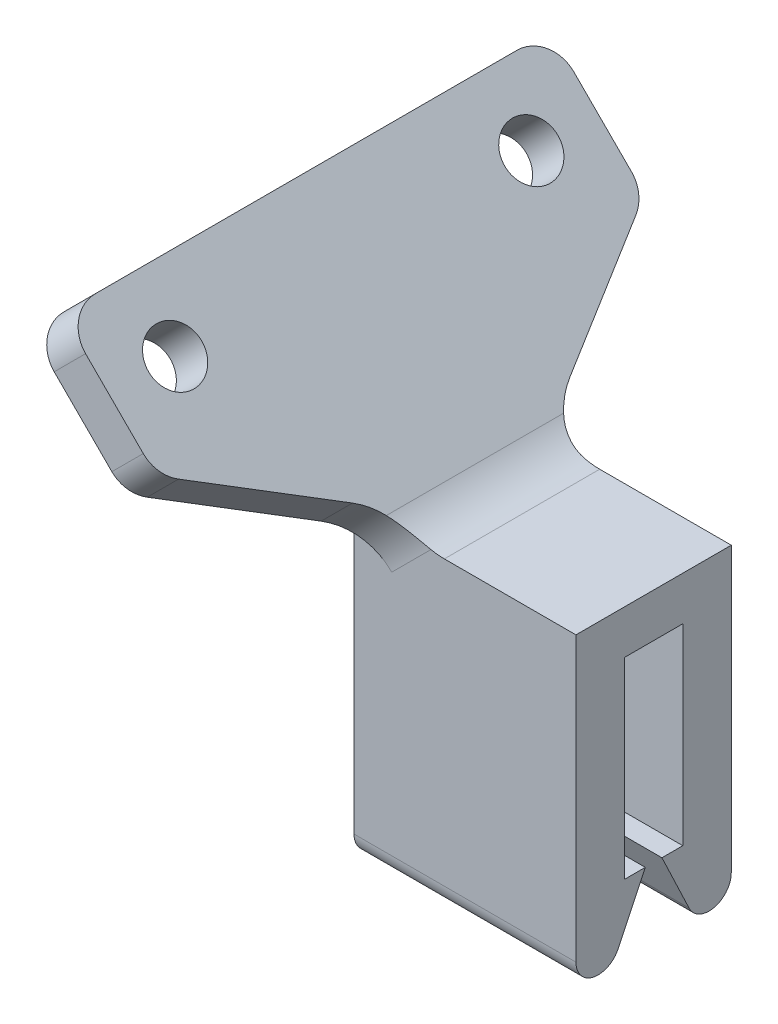
ISO-10303-21;
HEADER;
FILE_DESCRIPTION(('STEP AP214'),'2;1');
FILE_NAME('part.step','',(''),(''),'','','');
FILE_SCHEMA(('AUTOMOTIVE_DESIGN { 1 0 10303 214 1 1 1 1 }'));
ENDSEC;
DATA;
#1=APPLICATION_CONTEXT('core data for automotive mechanical design processes');
#2=APPLICATION_PROTOCOL_DEFINITION('international standard','automotive_design',2000,#1);
#3=PRODUCT_CONTEXT('',#1,'mechanical');
#4=PRODUCT('Part','Part','',(#3));
#5=PRODUCT_RELATED_PRODUCT_CATEGORY('part','',(#4));
#6=PRODUCT_DEFINITION_FORMATION('','',#4);
#7=PRODUCT_DEFINITION_CONTEXT('part definition',#1,'design');
#8=PRODUCT_DEFINITION('design','',#6,#7);
#9=PRODUCT_DEFINITION_SHAPE('','',#8);
#10=(LENGTH_UNIT() NAMED_UNIT(*) SI_UNIT(.MILLI.,.METRE.));
#11=(NAMED_UNIT(*) PLANE_ANGLE_UNIT() SI_UNIT($,.RADIAN.));
#12=(NAMED_UNIT(*) SI_UNIT($,.STERADIAN.) SOLID_ANGLE_UNIT());
#13=UNCERTAINTY_MEASURE_WITH_UNIT(LENGTH_MEASURE(1.E-05),#10,'distance_accuracy_value','');
#14=(GEOMETRIC_REPRESENTATION_CONTEXT(3) GLOBAL_UNCERTAINTY_ASSIGNED_CONTEXT((#13)) GLOBAL_UNIT_ASSIGNED_CONTEXT((#10,
#11,#12)) REPRESENTATION_CONTEXT('',''));
#15=CARTESIAN_POINT('',(0.,0.,0.));
#16=DIRECTION('',(0.,0.,1.));
#17=DIRECTION('',(1.,0.,0.));
#18=AXIS2_PLACEMENT_3D('',#15,#16,#17);
#19=CARTESIAN_POINT('',(10.,4.33,1.315));
#20=DIRECTION('',(0.,1.,0.));
#21=DIRECTION('',(0.,0.,1.));
#22=AXIS2_PLACEMENT_3D('',#19,#20,#21);
#23=PLANE('',#22);
#24=DIRECTION('',(0.,0.,-1.));
#25=VECTOR('',#24,1.);
#26=CARTESIAN_POINT('',(0.,4.33,1.315));
#27=LINE('',#26,#25);
#28=CARTESIAN_POINT('',(0.,4.33,1.315));
#29=VERTEX_POINT('',#28);
#30=CARTESIAN_POINT('',(0.,4.33,-1.315));
#31=VERTEX_POINT('',#30);
#32=EDGE_CURVE('E295',#29,#31,#27,.T.);
#33=ORIENTED_EDGE('',*,*,#32,.T.);
#34=DIRECTION('',(-1.,0.,0.));
#35=VECTOR('',#34,1.);
#36=CARTESIAN_POINT('',(10.,4.33,-1.315));
#37=LINE('',#36,#35);
#38=CARTESIAN_POINT('',(10.,4.33,-1.315));
#39=VERTEX_POINT('',#38);
#40=EDGE_CURVE('E383',#39,#31,#37,.T.);
#41=ORIENTED_EDGE('',*,*,#40,.F.);
#42=DIRECTION('',(0.,0.,-1.));
#43=VECTOR('',#42,1.);
#44=CARTESIAN_POINT('',(10.,4.33,1.315));
#45=LINE('',#44,#43);
#46=CARTESIAN_POINT('',(10.,4.33,1.315));
#47=VERTEX_POINT('',#46);
#48=EDGE_CURVE('E296',#47,#39,#45,.T.);
#49=ORIENTED_EDGE('',*,*,#48,.F.);
#50=DIRECTION('',(-1.,0.,0.));
#51=VECTOR('',#50,1.);
#52=CARTESIAN_POINT('',(10.,4.33,1.315));
#53=LINE('',#52,#51);
#54=EDGE_CURVE('E326',#47,#29,#53,.T.);
#55=ORIENTED_EDGE('',*,*,#54,.T.);
#56=EDGE_LOOP('',(#33,#41,#49,#55));
#57=FACE_BOUND('',#56,.T.);
#58=ADVANCED_FACE('F43',(#57),#23,.F.);
#59=CARTESIAN_POINT('',(10.,4.33,-1.315));
#60=DIRECTION('',(0.,0.,-1.));
#61=DIRECTION('',(0.,1.,0.));
#62=AXIS2_PLACEMENT_3D('',#59,#60,#61);
#63=PLANE('',#62);
#64=DIRECTION('',(0.,-1.,0.));
#65=VECTOR('',#64,1.);
#66=CARTESIAN_POINT('',(0.,4.33,-1.315));
#67=LINE('',#66,#65);
#68=CARTESIAN_POINT('',(0.,-4.33,-1.315));
#69=VERTEX_POINT('',#68);
#70=EDGE_CURVE('E329',#31,#69,#67,.T.);
#71=ORIENTED_EDGE('',*,*,#70,.T.);
#72=DIRECTION('',(-1.,0.,0.));
#73=VECTOR('',#72,1.);
#74=CARTESIAN_POINT('',(10.,-4.33,-1.315));
#75=LINE('',#74,#73);
#76=CARTESIAN_POINT('',(10.,-4.33,-1.315));
#77=VERTEX_POINT('',#76);
#78=EDGE_CURVE('E381',#77,#69,#75,.T.);
#79=ORIENTED_EDGE('',*,*,#78,.F.);
#80=DIRECTION('',(0.,-1.,0.));
#81=VECTOR('',#80,1.);
#82=CARTESIAN_POINT('',(10.,4.33,-1.315));
#83=LINE('',#82,#81);
#84=EDGE_CURVE('E299',#39,#77,#83,.T.);
#85=ORIENTED_EDGE('',*,*,#84,.F.);
#86=ORIENTED_EDGE('',*,*,#40,.T.);
#87=EDGE_LOOP('',(#71,#79,#85,#86));
#88=FACE_BOUND('',#87,.T.);
#89=ADVANCED_FACE('F442',(#88),#63,.F.);
#90=CARTESIAN_POINT('',(10.,-4.33,-0.375));
#91=DIRECTION('',(0.,1.,0.));
#92=DIRECTION('',(0.,0.,1.));
#93=AXIS2_PLACEMENT_3D('',#90,#91,#92);
#94=PLANE('',#93);
#95=DIRECTION('',(0.,0.,-1.));
#96=VECTOR('',#95,1.);
#97=CARTESIAN_POINT('',(0.,-4.33,-0.375));
#98=LINE('',#97,#96);
#99=CARTESIAN_POINT('',(0.,-4.33,-0.375));
#100=VERTEX_POINT('',#99);
#101=EDGE_CURVE('E332',#100,#69,#98,.T.);
#102=ORIENTED_EDGE('',*,*,#101,.F.);
#103=DIRECTION('',(-1.,0.,0.));
#104=VECTOR('',#103,1.);
#105=CARTESIAN_POINT('',(10.,-4.33,-0.375));
#106=LINE('',#105,#104);
#107=CARTESIAN_POINT('',(10.,-4.33,-0.375));
#108=VERTEX_POINT('',#107);
#109=EDGE_CURVE('E378',#108,#100,#106,.T.);
#110=ORIENTED_EDGE('',*,*,#109,.F.);
#111=DIRECTION('',(0.,0.,-1.));
#112=VECTOR('',#111,1.);
#113=CARTESIAN_POINT('',(10.,-4.33,-0.375));
#114=LINE('',#113,#112);
#115=EDGE_CURVE('E302',#108,#77,#114,.T.);
#116=ORIENTED_EDGE('',*,*,#115,.T.);
#117=ORIENTED_EDGE('',*,*,#78,.T.);
#118=EDGE_LOOP('',(#102,#110,#116,#117));
#119=FACE_BOUND('',#118,.T.);
#120=ADVANCED_FACE('F448',(#119),#94,.T.);
#121=CARTESIAN_POINT('',(10.,-6.31074986405307,-1.315));
#122=DIRECTION('',(0.,0.42873816679033,-0.903428793174795));
#123=DIRECTION('',(0.,0.903428793174795,0.42873816679033));
#124=AXIS2_PLACEMENT_3D('',#121,#122,#123);
#125=PLANE('',#124);
#126=DIRECTION('',(0.,-0.903428793174795,-0.42873816679033));
#127=VECTOR('',#126,1.);
#128=CARTESIAN_POINT('',(0.,-6.31074986405307,-1.315));
#129=LINE('',#128,#127);
#130=CARTESIAN_POINT('',(0.,-6.904071278564,-1.5965712068252));
#131=VERTEX_POINT('',#130);
#132=EDGE_CURVE('E335',#100,#131,#129,.T.);
#133=ORIENTED_EDGE('',*,*,#132,.T.);
#134=DIRECTION('',(-1.,0.,0.));
#135=VECTOR('',#134,1.);
#136=CARTESIAN_POINT('',(10.,-6.904071278564,-1.5965712068252));
#137=LINE('',#136,#135);
#138=CARTESIAN_POINT('',(10.,-6.904071278564,-1.5965712068252));
#139=VERTEX_POINT('',#138);
#140=EDGE_CURVE('E375',#139,#131,#137,.T.);
#141=ORIENTED_EDGE('',*,*,#140,.F.);
#142=DIRECTION('',(0.,0.903428793174795,0.428738166790331));
#143=VECTOR('',#142,1.);
#144=CARTESIAN_POINT('',(10.,-6.31074986405307,-1.315));
#145=LINE('',#144,#143);
#146=EDGE_CURVE('E305',#139,#108,#145,.T.);
#147=ORIENTED_EDGE('',*,*,#146,.T.);
#148=ORIENTED_EDGE('',*,*,#109,.T.);
#149=EDGE_LOOP('',(#133,#141,#147,#148));
#150=FACE_BOUND('',#149,.T.);
#151=ADVANCED_FACE('F602',(#150),#125,.F.);
#152=CARTESIAN_POINT('',(10.,-6.47533311177367,-2.5));
#153=DIRECTION('',(-1.,0.,0.));
#154=DIRECTION('',(0.,0.,1.));
#155=AXIS2_PLACEMENT_3D('',#152,#153,#154);
#156=CYLINDRICAL_SURFACE('',#155,1.);
#157=CARTESIAN_POINT('',(0.,-6.47533311177367,-2.5));
#158=DIRECTION('',(1.,0.,0.));
#159=DIRECTION('',(0.,0.,-1.));
#160=AXIS2_PLACEMENT_3D('',#157,#158,#159);
#161=CIRCLE('',#160,1.);
#162=CARTESIAN_POINT('',(0.,-6.47533311177367,-3.5));
#163=VERTEX_POINT('',#162);
#164=EDGE_CURVE('E337',#131,#163,#161,.T.);
#165=ORIENTED_EDGE('',*,*,#164,.T.);
#166=DIRECTION('',(-1.,0.,0.));
#167=VECTOR('',#166,1.);
#168=CARTESIAN_POINT('',(10.,-6.47533311177367,-3.5));
#169=LINE('',#168,#167);
#170=CARTESIAN_POINT('',(10.,-6.47533311177367,-3.5));
#171=VERTEX_POINT('',#170);
#172=EDGE_CURVE('E372',#171,#163,#169,.T.);
#173=ORIENTED_EDGE('',*,*,#172,.F.);
#174=CARTESIAN_POINT('',(10.,-6.47533311177367,-2.5));
#175=DIRECTION('',(1.,0.,0.));
#176=DIRECTION('',(0.,0.,-1.));
#177=AXIS2_PLACEMENT_3D('',#174,#175,#176);
#178=CIRCLE('',#177,1.);
#179=EDGE_CURVE('E308',#139,#171,#178,.T.);
#180=ORIENTED_EDGE('',*,*,#179,.F.);
#181=ORIENTED_EDGE('',*,*,#140,.T.);
#182=EDGE_LOOP('',(#165,#173,#180,#181));
#183=FACE_BOUND('',#182,.T.);
#184=ADVANCED_FACE('F599',(#183),#156,.T.);
#185=CARTESIAN_POINT('',(10.,-6.4753331117736,-3.5));
#186=DIRECTION('',(0.,0.,1.));
#187=DIRECTION('',(1.,0.,0.));
#188=AXIS2_PLACEMENT_3D('',#185,#186,#187);
#189=PLANE('',#188);
#190=DIRECTION('',(-0.707106781186548,0.707106781186548,0.));
#191=VECTOR('',#190,1.);
#192=CARTESIAN_POINT('',(11.3901665558868,-5.0851665558868,-3.5));
#193=LINE('',#192,#191);
#194=CARTESIAN_POINT('',(1.70203974095488,4.60296025904512,-3.5));
#195=VERTEX_POINT('',#194);
#196=CARTESIAN_POINT('',(-0.878679656440356,7.18367965644036,-3.5));
#197=VERTEX_POINT('',#196);
#198=EDGE_CURVE('E288',#195,#197,#193,.T.);
#199=ORIENTED_EDGE('',*,*,#198,.F.);
#200=DIRECTION('',(0.707106781186548,0.707106781186547,0.));
#201=VECTOR('',#200,1.);
#202=CARTESIAN_POINT('',(0.311873185068085,3.21279370315832,-3.5));
#203=LINE('',#202,#201);
#204=CARTESIAN_POINT('',(3.46577678018442,6.36669729827466,-3.5));
#205=VERTEX_POINT('',#204);
#206=EDGE_CURVE('E404',#195,#205,#203,.T.);
#207=ORIENTED_EDGE('',*,*,#206,.T.);
#208=CARTESIAN_POINT('',(4.07106781186547,9.30500000000001,-3.5));
#209=DIRECTION('',(0.,0.,1.));
#210=DIRECTION('',(1.,0.,0.));
#211=AXIS2_PLACEMENT_3D('',#208,#209,#210);
#212=CIRCLE('',#211,3.);
#213=CARTESIAN_POINT('',(4.07106781186547,6.30500000000001,-3.5));
#214=VERTEX_POINT('',#213);
#215=EDGE_CURVE('E399',#205,#214,#212,.T.);
#216=ORIENTED_EDGE('',*,*,#215,.T.);
#217=DIRECTION('',(-1.,0.,0.));
#218=VECTOR('',#217,1.);
#219=CARTESIAN_POINT('',(10.,6.30500000000001,-3.5));
#220=LINE('',#219,#218);
#221=CARTESIAN_POINT('',(10.,6.30500000000001,-3.5));
#222=VERTEX_POINT('',#221);
#223=EDGE_CURVE('E369',#222,#214,#220,.T.);
#224=ORIENTED_EDGE('',*,*,#223,.F.);
#225=DIRECTION('',(0.,1.,0.));
#226=VECTOR('',#225,1.);
#227=CARTESIAN_POINT('',(10.,-6.4753331117736,-3.5));
#228=LINE('',#227,#226);
#229=EDGE_CURVE('E310',#171,#222,#228,.T.);
#230=ORIENTED_EDGE('',*,*,#229,.F.);
#231=ORIENTED_EDGE('',*,*,#172,.T.);
#232=DIRECTION('',(0.,1.,0.));
#233=VECTOR('',#232,1.);
#234=CARTESIAN_POINT('',(0.,-6.4753331117736,-3.5));
#235=LINE('',#234,#233);
#236=CARTESIAN_POINT('',(0.,5.06235931288071,-3.5));
#237=VERTEX_POINT('',#236);
#238=EDGE_CURVE('E339',#163,#237,#235,.T.);
#239=ORIENTED_EDGE('',*,*,#238,.T.);
#240=CARTESIAN_POINT('',(-3.,5.06235931288072,-3.5));
#241=DIRECTION('',(0.,0.,1.));
#242=DIRECTION('',(1.,0.,0.));
#243=AXIS2_PLACEMENT_3D('',#240,#241,#242);
#244=CIRCLE('',#243,3.);
#245=EDGE_CURVE('E392',#237,#197,#244,.T.);
#246=ORIENTED_EDGE('',*,*,#245,.T.);
#247=EDGE_LOOP('',(#199,#207,#216,#224,#230,#231,#239,#246));
#248=FACE_BOUND('',#247,.T.);
#249=ADVANCED_FACE('F514',(#248),#189,.F.);
#250=CARTESIAN_POINT('',(10.,6.30500000000001,3.5));
#251=DIRECTION('',(0.,1.,0.));
#252=DIRECTION('',(0.,0.,1.));
#253=AXIS2_PLACEMENT_3D('',#250,#251,#252);
#254=PLANE('',#253);
#255=ORIENTED_EDGE('',*,*,#223,.T.);
#256=DIRECTION('',(0.,0.,-1.));
#257=VECTOR('',#256,1.);
#258=CARTESIAN_POINT('',(4.07106781186548,6.30500000000001,3.5));
#259=LINE('',#258,#257);
#260=CARTESIAN_POINT('',(4.07106781186548,6.30500000000001,3.5));
#261=VERTEX_POINT('',#260);
#262=EDGE_CURVE('E397',#214,#261,#259,.F.);
#263=ORIENTED_EDGE('',*,*,#262,.T.);
#264=DIRECTION('',(-1.,0.,0.));
#265=VECTOR('',#264,1.);
#266=CARTESIAN_POINT('',(10.,6.30500000000001,3.5));
#267=LINE('',#266,#265);
#268=CARTESIAN_POINT('',(10.,6.30500000000001,3.5));
#269=VERTEX_POINT('',#268);
#270=EDGE_CURVE('E366',#269,#261,#267,.T.);
#271=ORIENTED_EDGE('',*,*,#270,.F.);
#272=DIRECTION('',(0.,0.,-1.));
#273=VECTOR('',#272,1.);
#274=CARTESIAN_POINT('',(10.,6.30500000000001,3.5));
#275=LINE('',#274,#273);
#276=EDGE_CURVE('E312',#269,#222,#275,.T.);
#277=ORIENTED_EDGE('',*,*,#276,.T.);
#278=EDGE_LOOP('',(#255,#263,#271,#277));
#279=FACE_BOUND('',#278,.T.);
#280=ADVANCED_FACE('F594',(#279),#254,.T.);
#281=CARTESIAN_POINT('',(10.,6.30500000000001,3.5));
#282=DIRECTION('',(0.,0.,-1.));
#283=DIRECTION('',(0.,1.,0.));
#284=AXIS2_PLACEMENT_3D('',#281,#282,#283);
#285=PLANE('',#284);
#286=CARTESIAN_POINT('',(4.07106781186548,9.30500000000001,3.5));
#287=DIRECTION('',(0.,0.,-1.));
#288=DIRECTION('',(0.,1.,0.));
#289=AXIS2_PLACEMENT_3D('',#286,#287,#288);
#290=CIRCLE('',#289,3.);
#291=CARTESIAN_POINT('',(3.46577678018443,6.36669729827466,3.5));
#292=VERTEX_POINT('',#291);
#293=EDGE_CURVE('E401',#261,#292,#290,.T.);
#294=ORIENTED_EDGE('',*,*,#293,.T.);
#295=DIRECTION('',(0.707106781186548,0.707106781186547,0.));
#296=VECTOR('',#295,1.);
#297=CARTESIAN_POINT('',(6.70203974095489,9.60296025904512,3.5));
#298=LINE('',#297,#296);
#299=CARTESIAN_POINT('',(1.70203974095489,4.60296025904512,3.5));
#300=VERTEX_POINT('',#299);
#301=EDGE_CURVE('E412',#292,#300,#298,.F.);
#302=ORIENTED_EDGE('',*,*,#301,.T.);
#303=DIRECTION('',(0.707106781186548,-0.707106781186548,0.));
#304=VECTOR('',#303,1.);
#305=CARTESIAN_POINT('',(5.,1.30500000000001,3.5));
#306=LINE('',#305,#304);
#307=CARTESIAN_POINT('',(-0.878679656440356,7.18367965644036,3.5));
#308=VERTEX_POINT('',#307);
#309=EDGE_CURVE('E286',#308,#300,#306,.T.);
#310=ORIENTED_EDGE('',*,*,#309,.F.);
#311=CARTESIAN_POINT('',(-3.,5.06235931288072,3.5));
#312=DIRECTION('',(0.,0.,-1.));
#313=DIRECTION('',(0.,1.,0.));
#314=AXIS2_PLACEMENT_3D('',#311,#312,#313);
#315=CIRCLE('',#314,3.);
#316=CARTESIAN_POINT('',(0.,5.06235931288072,3.5));
#317=VERTEX_POINT('',#316);
#318=EDGE_CURVE('E394',#308,#317,#315,.T.);
#319=ORIENTED_EDGE('',*,*,#318,.T.);
#320=DIRECTION('',(0.,-1.,0.));
#321=VECTOR('',#320,1.);
#322=CARTESIAN_POINT('',(0.,6.30500000000001,3.5));
#323=LINE('',#322,#321);
#324=CARTESIAN_POINT('',(0.,-6.46785943351065,3.5));
#325=VERTEX_POINT('',#324);
#326=EDGE_CURVE('E342',#317,#325,#323,.T.);
#327=ORIENTED_EDGE('',*,*,#326,.T.);
#328=DIRECTION('',(-1.,0.,0.));
#329=VECTOR('',#328,1.);
#330=CARTESIAN_POINT('',(10.,-6.46785943351065,3.5));
#331=LINE('',#330,#329);
#332=CARTESIAN_POINT('',(10.,-6.46785943351065,3.5));
#333=VERTEX_POINT('',#332);
#334=EDGE_CURVE('E363',#333,#325,#331,.T.);
#335=ORIENTED_EDGE('',*,*,#334,.F.);
#336=DIRECTION('',(0.,-1.,0.));
#337=VECTOR('',#336,1.);
#338=CARTESIAN_POINT('',(10.,6.30500000000001,3.5));
#339=LINE('',#338,#337);
#340=EDGE_CURVE('E315',#269,#333,#339,.T.);
#341=ORIENTED_EDGE('',*,*,#340,.F.);
#342=ORIENTED_EDGE('',*,*,#270,.T.);
#343=EDGE_LOOP('',(#294,#302,#310,#319,#327,#335,#341,#342));
#344=FACE_BOUND('',#343,.T.);
#345=ADVANCED_FACE('F469',(#344),#285,.F.);
#346=CARTESIAN_POINT('',(10.,-6.46785943351065,2.5));
#347=DIRECTION('',(-1.,0.,0.));
#348=DIRECTION('',(0.,0.,1.));
#349=AXIS2_PLACEMENT_3D('',#346,#347,#348);
#350=CYLINDRICAL_SURFACE('',#349,1.);
#351=CARTESIAN_POINT('',(0.,-6.46785943351065,2.5));
#352=DIRECTION('',(1.,0.,0.));
#353=DIRECTION('',(0.,0.,-1.));
#354=AXIS2_PLACEMENT_3D('',#351,#352,#353);
#355=CIRCLE('',#354,1.);
#356=CARTESIAN_POINT('',(0.,-6.89761553915994,1.59705499079005));
#357=VERTEX_POINT('',#356);
#358=EDGE_CURVE('E344',#325,#357,#355,.T.);
#359=ORIENTED_EDGE('',*,*,#358,.T.);
#360=DIRECTION('',(-1.,0.,0.));
#361=VECTOR('',#360,1.);
#362=CARTESIAN_POINT('',(10.,-6.89761553915994,1.59705499079005));
#363=LINE('',#362,#361);
#364=CARTESIAN_POINT('',(10.,-6.89761553915994,1.59705499079005));
#365=VERTEX_POINT('',#364);
#366=EDGE_CURVE('E360',#365,#357,#363,.T.);
#367=ORIENTED_EDGE('',*,*,#366,.F.);
#368=CARTESIAN_POINT('',(10.,-6.46785943351065,2.5));
#369=DIRECTION('',(1.,0.,0.));
#370=DIRECTION('',(0.,0.,-1.));
#371=AXIS2_PLACEMENT_3D('',#368,#369,#370);
#372=CIRCLE('',#371,1.);
#373=EDGE_CURVE('E317',#333,#365,#372,.T.);
#374=ORIENTED_EDGE('',*,*,#373,.F.);
#375=ORIENTED_EDGE('',*,*,#334,.T.);
#376=EDGE_LOOP('',(#359,#367,#374,#375));
#377=FACE_BOUND('',#376,.T.);
#378=ADVANCED_FACE('F478',(#377),#350,.T.);
#379=CARTESIAN_POINT('',(10.,-6.305,1.315));
#380=DIRECTION('',(0.,0.429756105649292,0.902945009209949));
#381=DIRECTION('',(0.,-0.902945009209949,0.429756105649292));
#382=AXIS2_PLACEMENT_3D('',#379,#380,#381);
#383=PLANE('',#382);
#384=DIRECTION('',(0.,0.902945009209949,-0.429756105649292));
#385=VECTOR('',#384,1.);
#386=CARTESIAN_POINT('',(0.,-6.305,1.315));
#387=LINE('',#386,#385);
#388=CARTESIAN_POINT('',(0.,-4.33,0.375));
#389=VERTEX_POINT('',#388);
#390=EDGE_CURVE('E347',#357,#389,#387,.T.);
#391=ORIENTED_EDGE('',*,*,#390,.T.);
#392=DIRECTION('',(-1.,0.,0.));
#393=VECTOR('',#392,1.);
#394=CARTESIAN_POINT('',(10.,-4.33,0.375));
#395=LINE('',#394,#393);
#396=CARTESIAN_POINT('',(10.,-4.33,0.375));
#397=VERTEX_POINT('',#396);
#398=EDGE_CURVE('E357',#397,#389,#395,.T.);
#399=ORIENTED_EDGE('',*,*,#398,.F.);
#400=DIRECTION('',(0.,0.902945009209948,-0.429756105649294));
#401=VECTOR('',#400,1.);
#402=CARTESIAN_POINT('',(10.,-6.89761553915994,1.59705499079005));
#403=LINE('',#402,#401);
#404=EDGE_CURVE('E319',#365,#397,#403,.T.);
#405=ORIENTED_EDGE('',*,*,#404,.F.);
#406=ORIENTED_EDGE('',*,*,#366,.T.);
#407=EDGE_LOOP('',(#391,#399,#405,#406));
#408=FACE_BOUND('',#407,.T.);
#409=ADVANCED_FACE('F482',(#408),#383,.F.);
#410=CARTESIAN_POINT('',(10.,-4.33,0.375));
#411=DIRECTION('',(0.,-1.,0.));
#412=DIRECTION('',(0.,0.,-1.));
#413=AXIS2_PLACEMENT_3D('',#410,#411,#412);
#414=PLANE('',#413);
#415=DIRECTION('',(0.,0.,1.));
#416=VECTOR('',#415,1.);
#417=CARTESIAN_POINT('',(0.,-4.33,0.375));
#418=LINE('',#417,#416);
#419=CARTESIAN_POINT('',(0.,-4.33,1.315));
#420=VERTEX_POINT('',#419);
#421=EDGE_CURVE('E349',#389,#420,#418,.T.);
#422=ORIENTED_EDGE('',*,*,#421,.T.);
#423=DIRECTION('',(-1.,0.,0.));
#424=VECTOR('',#423,1.);
#425=CARTESIAN_POINT('',(10.,-4.33,1.315));
#426=LINE('',#425,#424);
#427=CARTESIAN_POINT('',(10.,-4.33,1.315));
#428=VERTEX_POINT('',#427);
#429=EDGE_CURVE('E355',#428,#420,#426,.T.);
#430=ORIENTED_EDGE('',*,*,#429,.F.);
#431=DIRECTION('',(0.,0.,1.));
#432=VECTOR('',#431,1.);
#433=CARTESIAN_POINT('',(10.,-4.33,0.375));
#434=LINE('',#433,#432);
#435=EDGE_CURVE('E321',#397,#428,#434,.T.);
#436=ORIENTED_EDGE('',*,*,#435,.F.);
#437=ORIENTED_EDGE('',*,*,#398,.T.);
#438=EDGE_LOOP('',(#422,#430,#436,#437));
#439=FACE_BOUND('',#438,.T.);
#440=ADVANCED_FACE('F583',(#439),#414,.F.);
#441=CARTESIAN_POINT('',(10.,4.33,1.315));
#442=DIRECTION('',(0.,0.,-1.));
#443=DIRECTION('',(0.,1.,0.));
#444=AXIS2_PLACEMENT_3D('',#441,#442,#443);
#445=PLANE('',#444);
#446=DIRECTION('',(0.,-1.,0.));
#447=VECTOR('',#446,1.);
#448=CARTESIAN_POINT('',(0.,4.33,1.315));
#449=LINE('',#448,#447);
#450=EDGE_CURVE('E300',#29,#420,#449,.T.);
#451=ORIENTED_EDGE('',*,*,#450,.F.);
#452=ORIENTED_EDGE('',*,*,#54,.F.);
#453=DIRECTION('',(0.,-1.,0.));
#454=VECTOR('',#453,1.);
#455=CARTESIAN_POINT('',(10.,4.33,1.315));
#456=LINE('',#455,#454);
#457=EDGE_CURVE('E323',#47,#428,#456,.T.);
#458=ORIENTED_EDGE('',*,*,#457,.T.);
#459=ORIENTED_EDGE('',*,*,#429,.T.);
#460=EDGE_LOOP('',(#451,#452,#458,#459));
#461=FACE_BOUND('',#460,.T.);
#462=ADVANCED_FACE('F578',(#461),#445,.T.);
#463=CARTESIAN_POINT('',(10.,-6.47533311177367,-2.5));
#464=DIRECTION('',(1.,0.,0.));
#465=DIRECTION('',(0.,0.,-1.));
#466=AXIS2_PLACEMENT_3D('',#463,#464,#465);
#467=PLANE('',#466);
#468=ORIENTED_EDGE('',*,*,#48,.T.);
#469=ORIENTED_EDGE('',*,*,#84,.T.);
#470=ORIENTED_EDGE('',*,*,#115,.F.);
#471=ORIENTED_EDGE('',*,*,#146,.F.);
#472=ORIENTED_EDGE('',*,*,#179,.T.);
#473=ORIENTED_EDGE('',*,*,#229,.T.);
#474=ORIENTED_EDGE('',*,*,#276,.F.);
#475=ORIENTED_EDGE('',*,*,#340,.T.);
#476=ORIENTED_EDGE('',*,*,#373,.T.);
#477=ORIENTED_EDGE('',*,*,#404,.T.);
#478=ORIENTED_EDGE('',*,*,#435,.T.);
#479=ORIENTED_EDGE('',*,*,#457,.F.);
#480=EDGE_LOOP('',(#468,#469,#470,#471,#472,#473,#474,#475,#476,#477,#478,#479));
#481=FACE_BOUND('',#480,.T.);
#482=ADVANCED_FACE('F486',(#481),#467,.T.);
#483=CARTESIAN_POINT('',(0.,-6.47533311177367,-2.5));
#484=DIRECTION('',(1.,0.,0.));
#485=DIRECTION('',(0.,0.,-1.));
#486=AXIS2_PLACEMENT_3D('',#483,#484,#485);
#487=PLANE('',#486);
#488=ORIENTED_EDGE('',*,*,#326,.F.);
#489=DIRECTION('',(0.,0.,-1.));
#490=VECTOR('',#489,1.);
#491=CARTESIAN_POINT('',(0.,5.06235931288072,-3.5));
#492=LINE('',#491,#490);
#493=EDGE_CURVE('E386',#317,#237,#492,.T.);
#494=ORIENTED_EDGE('',*,*,#493,.T.);
#495=ORIENTED_EDGE('',*,*,#238,.F.);
#496=ORIENTED_EDGE('',*,*,#164,.F.);
#497=ORIENTED_EDGE('',*,*,#132,.F.);
#498=ORIENTED_EDGE('',*,*,#101,.T.);
#499=ORIENTED_EDGE('',*,*,#70,.F.);
#500=ORIENTED_EDGE('',*,*,#32,.F.);
#501=ORIENTED_EDGE('',*,*,#450,.T.);
#502=ORIENTED_EDGE('',*,*,#421,.F.);
#503=ORIENTED_EDGE('',*,*,#390,.F.);
#504=ORIENTED_EDGE('',*,*,#358,.F.);
#505=EDGE_LOOP('',(#488,#494,#495,#496,#497,#498,#499,#500,#501,#502,#503,#504));
#506=FACE_BOUND('',#505,.T.);
#507=ADVANCED_FACE('F473',(#506),#487,.F.);
#508=CARTESIAN_POINT('',(0.,6.30500000000001,16.5384048104053));
#509=DIRECTION('',(0.707106781186548,0.707106781186548,0.));
#510=DIRECTION('',(-0.707106781186548,0.707106781186548,0.));
#511=AXIS2_PLACEMENT_3D('',#508,#509,#510);
#512=PLANE('',#511);
#513=DIRECTION('',(0.,0.,-1.));
#514=VECTOR('',#513,1.);
#515=CARTESIAN_POINT('',(-7.07106781186547,13.3760678118655,16.5384048104053));
#516=LINE('',#515,#514);
#517=CARTESIAN_POINT('',(-7.07106781186547,13.3760678118655,9.49999999999999));
#518=VERTEX_POINT('',#517);
#519=CARTESIAN_POINT('',(-7.07106781186548,13.3760678118655,-9.49999999999999));
#520=VERTEX_POINT('',#519);
#521=EDGE_CURVE('E291',#518,#520,#516,.T.);
#522=ORIENTED_EDGE('',*,*,#521,.T.);
#523=CARTESIAN_POINT('',(-6.01040764008565,12.3154076400857,-9.5));
#524=DIRECTION('',(0.707106781186548,0.707106781186548,0.));
#525=DIRECTION('',(-0.707106781186548,0.707106781186548,0.));
#526=AXIS2_PLACEMENT_3D('',#523,#524,#525);
#527=CIRCLE('',#526,1.5);
#528=CARTESIAN_POINT('',(-6.01040764008564,12.3154076400857,-11.));
#529=VERTEX_POINT('',#528);
#530=EDGE_CURVE('E267',#520,#529,#527,.F.);
#531=ORIENTED_EDGE('',*,*,#530,.T.);
#532=DIRECTION('',(0.707106781186548,-0.707106781186548,0.));
#533=VECTOR('',#532,1.);
#534=CARTESIAN_POINT('',(-6.01040764008565,12.3154076400857,-11.));
#535=LINE('',#534,#533);
#536=CARTESIAN_POINT('',(-3.41168004225727,9.71668004225727,-11.));
#537=VERTEX_POINT('',#536);
#538=EDGE_CURVE('E285',#529,#537,#535,.T.);
#539=ORIENTED_EDGE('',*,*,#538,.T.);
#540=CARTESIAN_POINT('',(-3.41168004225726,9.71668004225726,-9.5));
#541=DIRECTION('',(0.707106781186548,0.707106781186548,0.));
#542=DIRECTION('',(-0.707106781186548,0.707106781186548,0.));
#543=AXIS2_PLACEMENT_3D('',#540,#541,#542);
#544=CIRCLE('',#543,1.5);
#545=CARTESIAN_POINT('',(-2.51601158352098,8.82101158352099,-10.3034650110926));
#546=VERTEX_POINT('',#545);
#547=EDGE_CURVE('E226',#537,#546,#544,.F.);
#548=ORIENTED_EDGE('',*,*,#547,.T.);
#549=DIRECTION('',(0.378757038526448,-0.378757038526448,0.844444321156433));
#550=VECTOR('',#549,1.);
#551=CARTESIAN_POINT('',(-2.51601158352098,8.82101158352099,-10.3034650110926));
#552=LINE('',#551,#550);
#553=CARTESIAN_POINT('',(-0.0892971765176671,6.39429717651767,-4.89306997781489));
#554=VERTEX_POINT('',#553);
#555=EDGE_CURVE('E536',#546,#554,#552,.T.);
#556=ORIENTED_EDGE('',*,*,#555,.T.);
#557=CARTESIAN_POINT('',(1.70203974095489,4.60296025904512,-6.5));
#558=DIRECTION('',(0.707106781186548,0.707106781186548,0.));
#559=DIRECTION('',(-0.707106781186548,0.707106781186548,0.));
#560=AXIS2_PLACEMENT_3D('',#557,#558,#559);
#561=CIRCLE('',#560,3.);
#562=EDGE_CURVE('E498',#554,#195,#561,.T.);
#563=ORIENTED_EDGE('',*,*,#562,.T.);
#564=ORIENTED_EDGE('',*,*,#198,.T.);
#565=DIRECTION('',(0.,0.,-1.));
#566=VECTOR('',#565,1.);
#567=CARTESIAN_POINT('',(-0.878679656440356,7.18367965644036,3.5));
#568=LINE('',#567,#566);
#569=EDGE_CURVE('E389',#197,#308,#568,.F.);
#570=ORIENTED_EDGE('',*,*,#569,.T.);
#571=ORIENTED_EDGE('',*,*,#309,.T.);
#572=CARTESIAN_POINT('',(1.70203974095489,4.60296025904512,6.5));
#573=DIRECTION('',(0.707106781186548,0.707106781186548,0.));
#574=DIRECTION('',(-0.707106781186548,0.707106781186548,0.));
#575=AXIS2_PLACEMENT_3D('',#572,#573,#574);
#576=CIRCLE('',#575,3.);
#577=CARTESIAN_POINT('',(-0.0892971765176676,6.39429717651767,4.89306997781488));
#578=VERTEX_POINT('',#577);
#579=EDGE_CURVE('E11',#300,#578,#576,.T.);
#580=ORIENTED_EDGE('',*,*,#579,.T.);
#581=DIRECTION('',(-0.378757038526448,0.378757038526448,0.844444321156434));
#582=VECTOR('',#581,1.);
#583=CARTESIAN_POINT('',(-2.51601158352098,8.82101158352098,10.3034650110926));
#584=LINE('',#583,#582);
#585=CARTESIAN_POINT('',(-2.51601158352099,8.82101158352098,10.3034650110926));
#586=VERTEX_POINT('',#585);
#587=EDGE_CURVE('E525',#578,#586,#584,.T.);
#588=ORIENTED_EDGE('',*,*,#587,.T.);
#589=CARTESIAN_POINT('',(-3.41168004225726,9.71668004225726,9.5));
#590=DIRECTION('',(0.707106781186548,0.707106781186548,0.));
#591=DIRECTION('',(-0.707106781186548,0.707106781186548,0.));
#592=AXIS2_PLACEMENT_3D('',#589,#590,#591);
#593=CIRCLE('',#592,1.5);
#594=CARTESIAN_POINT('',(-3.41168004225726,9.71668004225728,11.));
#595=VERTEX_POINT('',#594);
#596=EDGE_CURVE('E532',#586,#595,#593,.F.);
#597=ORIENTED_EDGE('',*,*,#596,.T.);
#598=DIRECTION('',(-0.707106781186548,0.707106781186548,0.));
#599=VECTOR('',#598,1.);
#600=CARTESIAN_POINT('',(-6.01040764008564,12.3154076400857,11.));
#601=LINE('',#600,#599);
#602=CARTESIAN_POINT('',(-6.01040764008565,12.3154076400856,11.));
#603=VERTEX_POINT('',#602);
#604=EDGE_CURVE('E534',#595,#603,#601,.T.);
#605=ORIENTED_EDGE('',*,*,#604,.T.);
#606=CARTESIAN_POINT('',(-6.01040764008565,12.3154076400857,9.5));
#607=DIRECTION('',(0.707106781186548,0.707106781186548,0.));
#608=DIRECTION('',(-0.707106781186548,0.707106781186548,0.));
#609=AXIS2_PLACEMENT_3D('',#606,#607,#608);
#610=CIRCLE('',#609,1.5);
#611=EDGE_CURVE('E538',#603,#518,#610,.F.);
#612=ORIENTED_EDGE('',*,*,#611,.T.);
#613=EDGE_LOOP('',(#522,#531,#539,#548,#556,#563,#564,#570,#571,#580,#588,#597,#605,#612));
#614=FACE_BOUND('',#613,.T.);
#615=CARTESIAN_POINT('',(-4.94974746830583,11.2547474683058,8.025));
#616=DIRECTION('',(0.707106781186548,0.707106781186548,0.));
#617=DIRECTION('',(-0.707106781186548,0.707106781186548,0.));
#618=AXIS2_PLACEMENT_3D('',#615,#616,#617);
#619=CIRCLE('',#618,1.2);
#620=CARTESIAN_POINT('',(-5.79827560572969,12.1032756057297,8.025));
#621=VERTEX_POINT('',#620);
#622=EDGE_CURVE('E284',#621,#621,#619,.F.);
#623=ORIENTED_EDGE('',*,*,#622,.F.);
#624=EDGE_LOOP('',(#623));
#625=FACE_BOUND('',#624,.T.);
#626=CARTESIAN_POINT('',(-4.94974746830583,11.2547474683058,-8.025));
#627=DIRECTION('',(0.707106781186548,0.707106781186548,0.));
#628=DIRECTION('',(-0.707106781186548,0.707106781186548,0.));
#629=AXIS2_PLACEMENT_3D('',#626,#627,#628);
#630=CIRCLE('',#629,1.2);
#631=CARTESIAN_POINT('',(-5.79827560572969,12.1032756057297,-8.025));
#632=VERTEX_POINT('',#631);
#633=EDGE_CURVE('E281',#632,#632,#630,.F.);
#634=ORIENTED_EDGE('',*,*,#633,.F.);
#635=EDGE_LOOP('',(#634));
#636=FACE_BOUND('',#635,.T.);
#637=ADVANCED_FACE('F516',(#614,#625,#636),#512,.F.);
#638=CARTESIAN_POINT('',(-7.07106781186547,13.3760678118655,16.5384048104053));
#639=DIRECTION('',(0.707106781186548,-0.707106781186548,0.));
#640=DIRECTION('',(0.707106781186548,0.707106781186548,0.));
#641=AXIS2_PLACEMENT_3D('',#638,#639,#640);
#642=PLANE('',#641);
#643=ORIENTED_EDGE('',*,*,#521,.F.);
#644=DIRECTION('',(0.707106781186548,0.707106781186547,0.));
#645=VECTOR('',#644,1.);
#646=CARTESIAN_POINT('',(-24.3875452161533,-3.94040959242234,9.49999999999999));
#647=LINE('',#646,#645);
#648=CARTESIAN_POINT('',(-5.65685424949237,14.7902813742386,9.49999999999999));
#649=VERTEX_POINT('',#648);
#650=EDGE_CURVE('E274',#518,#649,#647,.T.);
#651=ORIENTED_EDGE('',*,*,#650,.T.);
#652=DIRECTION('',(0.,0.,-1.));
#653=VECTOR('',#652,1.);
#654=CARTESIAN_POINT('',(-5.65685424949238,14.7902813742386,16.5384048104053));
#655=LINE('',#654,#653);
#656=CARTESIAN_POINT('',(-5.65685424949238,14.7902813742386,-9.49999999999999));
#657=VERTEX_POINT('',#656);
#658=EDGE_CURVE('E293',#649,#657,#655,.T.);
#659=ORIENTED_EDGE('',*,*,#658,.T.);
#660=DIRECTION('',(0.707106781186548,0.707106781186547,0.));
#661=VECTOR('',#660,1.);
#662=CARTESIAN_POINT('',(-24.3875452161533,-3.94040959242234,-9.49999999999999));
#663=LINE('',#662,#661);
#664=EDGE_CURVE('E277',#520,#657,#663,.T.);
#665=ORIENTED_EDGE('',*,*,#664,.F.);
#666=EDGE_LOOP('',(#643,#651,#659,#665));
#667=FACE_BOUND('',#666,.T.);
#668=ADVANCED_FACE('F462',(#667),#642,.F.);
#669=CARTESIAN_POINT('',(-5.65685424949238,14.7902813742386,16.5384048104053));
#670=DIRECTION('',(-0.707106781186548,-0.707106781186548,0.));
#671=DIRECTION('',(0.707106781186548,-0.707106781186548,0.));
#672=AXIS2_PLACEMENT_3D('',#669,#670,#671);
#673=PLANE('',#672);
#674=ORIENTED_EDGE('',*,*,#658,.F.);
#675=CARTESIAN_POINT('',(-4.59619407771255,13.7296212024588,9.5));
#676=DIRECTION('',(0.707106781186548,0.707106781186547,0.));
#677=DIRECTION('',(-0.707106781186547,0.707106781186548,0.));
#678=AXIS2_PLACEMENT_3D('',#675,#676,#677);
#679=CIRCLE('',#678,1.5);
#680=CARTESIAN_POINT('',(-4.59619407771254,13.7296212024587,11.));
#681=VERTEX_POINT('',#680);
#682=EDGE_CURVE('E252',#649,#681,#679,.T.);
#683=ORIENTED_EDGE('',*,*,#682,.T.);
#684=DIRECTION('',(0.707106781186548,-0.707106781186547,0.));
#685=VECTOR('',#684,1.);
#686=CARTESIAN_POINT('',(-4.59619407771255,13.7296212024587,11.));
#687=LINE('',#686,#685);
#688=CARTESIAN_POINT('',(-1.99746647988417,11.1308936046304,11.));
#689=VERTEX_POINT('',#688);
#690=EDGE_CURVE('E255',#681,#689,#687,.T.);
#691=ORIENTED_EDGE('',*,*,#690,.T.);
#692=CARTESIAN_POINT('',(-1.99746647988416,11.1308936046304,9.5));
#693=DIRECTION('',(0.707106781186548,0.707106781186547,0.));
#694=DIRECTION('',(-0.707106781186547,0.707106781186548,0.));
#695=AXIS2_PLACEMENT_3D('',#692,#693,#694);
#696=CIRCLE('',#695,1.5);
#697=CARTESIAN_POINT('',(-1.10179802114788,10.2352251458941,10.3034650110926));
#698=VERTEX_POINT('',#697);
#699=EDGE_CURVE('E258',#689,#698,#696,.T.);
#700=ORIENTED_EDGE('',*,*,#699,.T.);
#701=DIRECTION('',(0.378757038526448,-0.378757038526448,-0.844444321156433));
#702=VECTOR('',#701,1.);
#703=CARTESIAN_POINT('',(-1.10179802114788,10.2352251458941,10.3034650110926));
#704=LINE('',#703,#702);
#705=CARTESIAN_POINT('',(1.32491638585543,7.80851073889077,4.89306997781489));
#706=VERTEX_POINT('',#705);
#707=EDGE_CURVE('E261',#698,#706,#704,.T.);
#708=ORIENTED_EDGE('',*,*,#707,.T.);
#709=CARTESIAN_POINT('',(3.11625330332798,6.01717382141821,6.5));
#710=DIRECTION('',(-0.707106781186548,-0.707106781186548,0.));
#711=DIRECTION('',(0.707106781186548,-0.707106781186548,0.));
#712=AXIS2_PLACEMENT_3D('',#709,#710,#711);
#713=CIRCLE('',#712,3.);
#714=CARTESIAN_POINT('',(1.94974746830583,7.18367965644036,3.99430084133818));
#715=VERTEX_POINT('',#714);
#716=EDGE_CURVE('E497',#706,#715,#713,.T.);
#717=ORIENTED_EDGE('',*,*,#716,.T.);
#718=DIRECTION('',(0.,0.,-1.));
#719=VECTOR('',#718,1.);
#720=CARTESIAN_POINT('',(1.94974746830584,7.18367965644036,16.5384048104053));
#721=LINE('',#720,#719);
#722=CARTESIAN_POINT('',(1.94974746830583,7.18367965644036,-3.99430084133818));
#723=VERTEX_POINT('',#722);
#724=EDGE_CURVE('E59',#715,#723,#721,.T.);
#725=ORIENTED_EDGE('',*,*,#724,.T.);
#726=CARTESIAN_POINT('',(3.11625330332798,6.01717382141821,-6.5));
#727=DIRECTION('',(-0.707106781186548,-0.707106781186548,0.));
#728=DIRECTION('',(0.707106781186548,-0.707106781186548,0.));
#729=AXIS2_PLACEMENT_3D('',#726,#727,#728);
#730=CIRCLE('',#729,3.);
#731=CARTESIAN_POINT('',(1.32491638585543,7.80851073889077,-4.89306997781489));
#732=VERTEX_POINT('',#731);
#733=EDGE_CURVE('E422',#723,#732,#730,.T.);
#734=ORIENTED_EDGE('',*,*,#733,.T.);
#735=DIRECTION('',(-0.378757038526448,0.378757038526448,-0.844444321156433));
#736=VECTOR('',#735,1.);
#737=CARTESIAN_POINT('',(-1.10179802114788,10.2352251458941,-10.3034650110926));
#738=LINE('',#737,#736);
#739=CARTESIAN_POINT('',(-1.10179802114788,10.2352251458941,-10.3034650110926));
#740=VERTEX_POINT('',#739);
#741=EDGE_CURVE('E230',#732,#740,#738,.T.);
#742=ORIENTED_EDGE('',*,*,#741,.T.);
#743=CARTESIAN_POINT('',(-1.99746647988416,11.1308936046304,-9.5));
#744=DIRECTION('',(0.707106781186548,0.707106781186547,0.));
#745=DIRECTION('',(0.707106781186547,-0.707106781186548,0.));
#746=AXIS2_PLACEMENT_3D('',#743,#744,#745);
#747=CIRCLE('',#746,1.5);
#748=CARTESIAN_POINT('',(-1.99746647988417,11.1308936046304,-11.));
#749=VERTEX_POINT('',#748);
#750=EDGE_CURVE('E225',#740,#749,#747,.T.);
#751=ORIENTED_EDGE('',*,*,#750,.T.);
#752=DIRECTION('',(-0.707106781186547,0.707106781186548,0.));
#753=VECTOR('',#752,1.);
#754=CARTESIAN_POINT('',(-4.59619407771255,13.7296212024588,-11.));
#755=LINE('',#754,#753);
#756=CARTESIAN_POINT('',(-4.59619407771255,13.7296212024588,-11.));
#757=VERTEX_POINT('',#756);
#758=EDGE_CURVE('E233',#749,#757,#755,.T.);
#759=ORIENTED_EDGE('',*,*,#758,.T.);
#760=CARTESIAN_POINT('',(-4.59619407771255,13.7296212024588,-9.5));
#761=DIRECTION('',(0.707106781186548,0.707106781186547,0.));
#762=DIRECTION('',(0.707106781186547,-0.707106781186548,0.));
#763=AXIS2_PLACEMENT_3D('',#760,#761,#762);
#764=CIRCLE('',#763,1.5);
#765=EDGE_CURVE('E238',#757,#657,#764,.T.);
#766=ORIENTED_EDGE('',*,*,#765,.T.);
#767=EDGE_LOOP('',(#674,#683,#691,#700,#708,#717,#725,#734,#742,#751,#759,#766));
#768=FACE_BOUND('',#767,.T.);
#769=CARTESIAN_POINT('',(-3.53553390593273,12.6689610306789,8.025));
#770=DIRECTION('',(0.707106781186548,0.707106781186547,0.));
#771=DIRECTION('',(-0.707106781186547,0.707106781186548,0.));
#772=AXIS2_PLACEMENT_3D('',#769,#770,#771);
#773=CIRCLE('',#772,1.2);
#774=CARTESIAN_POINT('',(-4.38406204335659,13.5174891681028,8.025));
#775=VERTEX_POINT('',#774);
#776=EDGE_CURVE('E244',#775,#775,#773,.T.);
#777=ORIENTED_EDGE('',*,*,#776,.F.);
#778=EDGE_LOOP('',(#777));
#779=FACE_BOUND('',#778,.T.);
#780=CARTESIAN_POINT('',(-3.53553390593273,12.6689610306789,-8.025));
#781=DIRECTION('',(0.707106781186548,0.707106781186547,0.));
#782=DIRECTION('',(-0.707106781186547,0.707106781186548,0.));
#783=AXIS2_PLACEMENT_3D('',#780,#781,#782);
#784=CIRCLE('',#783,1.2);
#785=CARTESIAN_POINT('',(-4.38406204335659,13.5174891681028,-8.025));
#786=VERTEX_POINT('',#785);
#787=EDGE_CURVE('E247',#786,#786,#784,.T.);
#788=ORIENTED_EDGE('',*,*,#787,.F.);
#789=EDGE_LOOP('',(#788));
#790=FACE_BOUND('',#789,.T.);
#791=ADVANCED_FACE('F240',(#768,#779,#790),#673,.F.);
#792=CARTESIAN_POINT('',(-3.,5.06235931288072,-2.5));
#793=DIRECTION('',(0.,0.,1.));
#794=DIRECTION('',(1.,0.,0.));
#795=AXIS2_PLACEMENT_3D('',#792,#793,#794);
#796=CYLINDRICAL_SURFACE('',#795,3.);
#797=ORIENTED_EDGE('',*,*,#318,.F.);
#798=ORIENTED_EDGE('',*,*,#569,.F.);
#799=ORIENTED_EDGE('',*,*,#245,.F.);
#800=ORIENTED_EDGE('',*,*,#493,.F.);
#801=EDGE_LOOP('',(#797,#798,#799,#800));
#802=FACE_BOUND('',#801,.T.);
#803=ADVANCED_FACE('F452',(#802),#796,.F.);
#804=CARTESIAN_POINT('',(4.07106781186548,9.30500000000001,16.5384048104053));
#805=DIRECTION('',(0.,0.,-1.));
#806=DIRECTION('',(-1.,0.,0.));
#807=AXIS2_PLACEMENT_3D('',#804,#805,#806);
#808=CYLINDRICAL_SURFACE('',#807,3.);
#809=ORIENTED_EDGE('',*,*,#293,.F.);
#810=ORIENTED_EDGE('',*,*,#262,.F.);
#811=ORIENTED_EDGE('',*,*,#215,.F.);
#812=CARTESIAN_POINT('',(3.46577678018442,6.36669729827466,-3.5));
#813=CARTESIAN_POINT('',(3.40258040117505,6.37970438073351,-3.49999225378921));
#814=CARTESIAN_POINT('',(3.3397948599831,6.39477466117202,-3.50145188074339));
#815=CARTESIAN_POINT('',(3.21544431834849,6.42888282766828,-3.50762558399546));
#816=CARTESIAN_POINT('',(3.15387991015202,6.44792258976051,-3.51234120156668));
#817=CARTESIAN_POINT('',(3.03250386481521,6.4897732302882,-3.52533941678526));
#818=CARTESIAN_POINT('',(2.97269021795011,6.51257956773123,-3.53361773829546));
#819=CARTESIAN_POINT('',(2.85521313804441,6.56168841136028,-3.55396517555681));
#820=CARTESIAN_POINT('',(2.79754922543549,6.58799013173825,-3.56603344010771));
#821=CARTESIAN_POINT('',(2.62802328113957,6.67184875638627,-3.60830320783088));
#822=CARTESIAN_POINT('',(2.51994234827571,6.73424884805665,-3.64453855149798));
#823=CARTESIAN_POINT('',(2.31714857768851,6.86808907367527,-3.73326325049451));
#824=CARTESIAN_POINT('',(2.22241623983223,6.93951572554729,-3.78572853058614));
#825=CARTESIAN_POINT('',(2.102069943628,7.04116915399745,-3.86840300676317));
#826=CARTESIAN_POINT('',(2.07011170276852,7.06939143277922,-3.89216022508363));
#827=CARTESIAN_POINT('',(2.00834175767238,7.12625841131243,-3.94171413370261));
#828=CARTESIAN_POINT('',(1.97852670494361,7.15490236398287,-3.96750750432535));
#829=CARTESIAN_POINT('',(1.94974746830583,7.18367965644036,-3.99430084133818));
#830=B_SPLINE_CURVE_WITH_KNOTS('',3,(#812,#813,#814,#815,#816,#817,#818,#819,#820,#821,#822,
#823,#824,#825,#826,#827,#828,#829),.UNSPECIFIED.,.F.,.F.,(4,2,2,2,2,2,2,2,4),(0.,
0.193532077167413,0.387155828588009,0.580547828316786,0.773896424297581,1.16158609715644,
1.54870341268917,1.69505819981135,1.84117911661761),.UNSPECIFIED.);
#831=EDGE_CURVE('E415',#205,#723,#830,.T.);
#832=ORIENTED_EDGE('',*,*,#831,.T.);
#833=ORIENTED_EDGE('',*,*,#724,.F.);
#834=CARTESIAN_POINT('',(1.94974746830583,7.18367965644036,3.99430084133818));
#835=CARTESIAN_POINT('',(1.98784372164177,7.14557244830806,3.95881164940432));
#836=CARTESIAN_POINT('',(2.0278037445743,7.10767664961014,3.92507186495949));
#837=CARTESIAN_POINT('',(2.11139856607431,7.03281276297929,3.86126086954877));
#838=CARTESIAN_POINT('',(2.15503509638075,6.99584512299702,3.83119140392091));
#839=CARTESIAN_POINT('',(2.24583956543739,6.92342290618916,3.77495845090377));
#840=CARTESIAN_POINT('',(2.29300321486815,6.88796657131179,3.74879033145796));
#841=CARTESIAN_POINT('',(2.39068398750279,6.81906142041169,3.70044668796897));
#842=CARTESIAN_POINT('',(2.44120035569733,6.78561215561933,3.67827026916959));
#843=CARTESIAN_POINT('',(2.59778187956554,6.6888091105436,3.61769432652049));
#844=CARTESIAN_POINT('',(2.70864464905828,6.62919085550211,3.58539309394227));
#845=CARTESIAN_POINT('',(2.93969948348038,6.52361169371839,3.53663557470814));
#846=CARTESIAN_POINT('',(3.05987753367417,6.47763075418388,3.52015596610847));
#847=CARTESIAN_POINT('',(3.22933707873719,6.42509057459251,3.50693811255973));
#848=CARTESIAN_POINT('',(3.27622622873435,6.41179920494841,3.50429638844033));
#849=CARTESIAN_POINT('',(3.3705845953678,6.38752064795251,3.50082946753576));
#850=CARTESIAN_POINT('',(3.4180527653444,6.37652981252991,3.50000137474306));
#851=CARTESIAN_POINT('',(3.46577678018443,6.36669729827466,3.5));
#852=B_SPLINE_CURVE_WITH_KNOTS('',3,(#834,#835,#836,#837,#838,#839,#840,#841,#842,#843,#844,
#845,#846,#847,#848,#849,#850,#851),.UNSPECIFIED.,.F.,.F.,(4,2,2,2,2,2,2,2,4),(0.,
0.193532077167412,0.387155828588008,0.580547828316785,0.77389642429758,1.16158609715644,
1.54870341268917,1.69505819981135,1.84117911661761),.UNSPECIFIED.);
#853=EDGE_CURVE('E52',#715,#292,#852,.T.);
#854=ORIENTED_EDGE('',*,*,#853,.T.);
#855=EDGE_LOOP('',(#809,#810,#811,#832,#833,#854));
#856=FACE_BOUND('',#855,.T.);
#857=ADVANCED_FACE('F424',(#856),#808,.F.);
#858=CARTESIAN_POINT('',(-23.3268850443735,-5.00106976420216,9.5));
#859=DIRECTION('',(0.707106781186548,0.707106781186547,0.));
#860=DIRECTION('',(-0.707106781186547,0.707106781186548,0.));
#861=AXIS2_PLACEMENT_3D('',#858,#859,#860);
#862=CYLINDRICAL_SURFACE('',#861,1.5);
#863=ORIENTED_EDGE('',*,*,#611,.F.);
#864=DIRECTION('',(0.707106781186548,0.707106781186547,0.));
#865=VECTOR('',#864,1.);
#866=CARTESIAN_POINT('',(-23.3268850443735,-5.00106976420217,11.));
#867=LINE('',#866,#865);
#868=EDGE_CURVE('E272',#603,#681,#867,.T.);
#869=ORIENTED_EDGE('',*,*,#868,.T.);
#870=ORIENTED_EDGE('',*,*,#682,.F.);
#871=ORIENTED_EDGE('',*,*,#650,.F.);
#872=EDGE_LOOP('',(#863,#869,#870,#871));
#873=FACE_BOUND('',#872,.T.);
#874=ADVANCED_FACE('F460',(#873),#862,.T.);
#875=CARTESIAN_POINT('',(-23.3268850443735,-5.00106976420217,11.));
#876=DIRECTION('',(0.,0.,1.));
#877=DIRECTION('',(1.,0.,0.));
#878=AXIS2_PLACEMENT_3D('',#875,#876,#877);
#879=PLANE('',#878);
#880=ORIENTED_EDGE('',*,*,#604,.F.);
#881=DIRECTION('',(0.707106781186548,0.707106781186547,0.));
#882=VECTOR('',#881,1.);
#883=CARTESIAN_POINT('',(-20.7281574465451,-7.59979736203055,11.));
#884=LINE('',#883,#882);
#885=EDGE_CURVE('E270',#595,#689,#884,.T.);
#886=ORIENTED_EDGE('',*,*,#885,.T.);
#887=ORIENTED_EDGE('',*,*,#690,.F.);
#888=ORIENTED_EDGE('',*,*,#868,.F.);
#889=EDGE_LOOP('',(#880,#886,#887,#888));
#890=FACE_BOUND('',#889,.T.);
#891=ADVANCED_FACE('F702',(#890),#879,.T.);
#892=CARTESIAN_POINT('',(-20.7281574465451,-7.59979736203055,9.5));
#893=DIRECTION('',(0.707106781186548,0.707106781186547,0.));
#894=DIRECTION('',(-0.707106781186547,0.707106781186548,0.));
#895=AXIS2_PLACEMENT_3D('',#892,#893,#894);
#896=CYLINDRICAL_SURFACE('',#895,1.5);
#897=ORIENTED_EDGE('',*,*,#596,.F.);
#898=DIRECTION('',(0.707106781186548,0.707106781186547,0.));
#899=VECTOR('',#898,1.);
#900=CARTESIAN_POINT('',(-19.8324889878088,-8.49546582076683,10.3034650110926));
#901=LINE('',#900,#899);
#902=EDGE_CURVE('E268',#586,#698,#901,.T.);
#903=ORIENTED_EDGE('',*,*,#902,.T.);
#904=ORIENTED_EDGE('',*,*,#699,.F.);
#905=ORIENTED_EDGE('',*,*,#885,.F.);
#906=EDGE_LOOP('',(#897,#903,#904,#905));
#907=FACE_BOUND('',#906,.T.);
#908=ADVANCED_FACE('F531',(#907),#896,.T.);
#909=CARTESIAN_POINT('',(-22.2662248725937,-6.06172993598198,8.025));
#910=DIRECTION('',(0.707106781186548,0.707106781186547,0.));
#911=DIRECTION('',(-0.707106781186547,0.707106781186548,0.));
#912=AXIS2_PLACEMENT_3D('',#909,#910,#911);
#913=CYLINDRICAL_SURFACE('',#912,1.2);
#914=ORIENTED_EDGE('',*,*,#622,.T.);
#915=EDGE_LOOP('',(#914));
#916=FACE_BOUND('',#915,.T.);
#917=ORIENTED_EDGE('',*,*,#776,.T.);
#918=EDGE_LOOP('',(#917));
#919=FACE_BOUND('',#918,.T.);
#920=ADVANCED_FACE('F719',(#916,#919),#913,.F.);
#921=CARTESIAN_POINT('',(-19.8324889878088,-8.49546582076683,10.3034650110926));
#922=DIRECTION('',(0.597112305824185,-0.597112305824185,0.535643340728371));
#923=DIRECTION('',(0.707106781186547,0.707106781186547,0.));
#924=AXIS2_PLACEMENT_3D('',#921,#922,#923);
#925=PLANE('',#924);
#926=ORIENTED_EDGE('',*,*,#587,.F.);
#927=DIRECTION('',(0.707106781186548,0.707106781186547,0.));
#928=VECTOR('',#927,1.);
#929=CARTESIAN_POINT('',(-17.4057745808055,-10.9221802277702,4.89306997781488));
#930=LINE('',#929,#928);
#931=EDGE_CURVE('E409',#578,#706,#930,.T.);
#932=ORIENTED_EDGE('',*,*,#931,.T.);
#933=ORIENTED_EDGE('',*,*,#707,.F.);
#934=ORIENTED_EDGE('',*,*,#902,.F.);
#935=EDGE_LOOP('',(#926,#932,#933,#934));
#936=FACE_BOUND('',#935,.T.);
#937=ADVANCED_FACE('F523',(#936),#925,.T.);
#938=CARTESIAN_POINT('',(-23.3268850443735,-5.00106976420217,-11.));
#939=DIRECTION('',(0.,0.,-1.));
#940=DIRECTION('',(-1.,0.,0.));
#941=AXIS2_PLACEMENT_3D('',#938,#939,#940);
#942=PLANE('',#941);
#943=ORIENTED_EDGE('',*,*,#538,.F.);
#944=DIRECTION('',(0.707106781186548,0.707106781186547,0.));
#945=VECTOR('',#944,1.);
#946=CARTESIAN_POINT('',(-23.3268850443735,-5.00106976420217,-11.));
#947=LINE('',#946,#945);
#948=EDGE_CURVE('E229',#529,#757,#947,.T.);
#949=ORIENTED_EDGE('',*,*,#948,.T.);
#950=ORIENTED_EDGE('',*,*,#758,.F.);
#951=DIRECTION('',(0.707106781186548,0.707106781186547,0.));
#952=VECTOR('',#951,1.);
#953=CARTESIAN_POINT('',(-20.7281574465451,-7.59979736203055,-11.));
#954=LINE('',#953,#952);
#955=EDGE_CURVE('E220',#537,#749,#954,.T.);
#956=ORIENTED_EDGE('',*,*,#955,.F.);
#957=EDGE_LOOP('',(#943,#949,#950,#956));
#958=FACE_BOUND('',#957,.T.);
#959=ADVANCED_FACE('F234',(#958),#942,.T.);
#960=CARTESIAN_POINT('',(-23.3268850443735,-5.00106976420216,-9.5));
#961=DIRECTION('',(0.707106781186548,0.707106781186547,0.));
#962=DIRECTION('',(-0.707106781186547,0.707106781186548,0.));
#963=AXIS2_PLACEMENT_3D('',#960,#961,#962);
#964=CYLINDRICAL_SURFACE('',#963,1.5);
#965=ORIENTED_EDGE('',*,*,#530,.F.);
#966=ORIENTED_EDGE('',*,*,#664,.T.);
#967=ORIENTED_EDGE('',*,*,#765,.F.);
#968=ORIENTED_EDGE('',*,*,#948,.F.);
#969=EDGE_LOOP('',(#965,#966,#967,#968));
#970=FACE_BOUND('',#969,.T.);
#971=ADVANCED_FACE('F560',(#970),#964,.T.);
#972=CARTESIAN_POINT('',(-19.8324889878088,-8.49546582076683,-10.3034650110926));
#973=DIRECTION('',(0.597112305824185,-0.597112305824185,-0.535643340728372));
#974=DIRECTION('',(0.707106781186548,0.707106781186547,0.));
#975=AXIS2_PLACEMENT_3D('',#972,#973,#974);
#976=PLANE('',#975);
#977=ORIENTED_EDGE('',*,*,#741,.F.);
#978=DIRECTION('',(0.707106781186548,0.707106781186547,0.));
#979=VECTOR('',#978,1.);
#980=CARTESIAN_POINT('',(-17.4057745808055,-10.9221802277702,-4.89306997781489));
#981=LINE('',#980,#979);
#982=EDGE_CURVE('E407',#732,#554,#981,.F.);
#983=ORIENTED_EDGE('',*,*,#982,.T.);
#984=ORIENTED_EDGE('',*,*,#555,.F.);
#985=DIRECTION('',(0.707106781186548,0.707106781186547,0.));
#986=VECTOR('',#985,1.);
#987=CARTESIAN_POINT('',(-19.8324889878088,-8.49546582076683,-10.3034650110926));
#988=LINE('',#987,#986);
#989=EDGE_CURVE('E265',#546,#740,#988,.T.);
#990=ORIENTED_EDGE('',*,*,#989,.T.);
#991=EDGE_LOOP('',(#977,#983,#984,#990));
#992=FACE_BOUND('',#991,.T.);
#993=ADVANCED_FACE('F511',(#992),#976,.T.);
#994=CARTESIAN_POINT('',(-20.7281574465451,-7.59979736203055,-9.5));
#995=DIRECTION('',(0.707106781186548,0.707106781186547,0.));
#996=DIRECTION('',(-0.707106781186547,0.707106781186548,0.));
#997=AXIS2_PLACEMENT_3D('',#994,#995,#996);
#998=CYLINDRICAL_SURFACE('',#997,1.5);
#999=ORIENTED_EDGE('',*,*,#547,.F.);
#1000=ORIENTED_EDGE('',*,*,#955,.T.);
#1001=ORIENTED_EDGE('',*,*,#750,.F.);
#1002=ORIENTED_EDGE('',*,*,#989,.F.);
#1003=EDGE_LOOP('',(#999,#1000,#1001,#1002));
#1004=FACE_BOUND('',#1003,.T.);
#1005=ADVANCED_FACE('F222',(#1004),#998,.T.);
#1006=CARTESIAN_POINT('',(-22.2662248725937,-6.06172993598198,-8.025));
#1007=DIRECTION('',(0.707106781186548,0.707106781186547,0.));
#1008=DIRECTION('',(-0.707106781186547,0.707106781186548,0.));
#1009=AXIS2_PLACEMENT_3D('',#1006,#1007,#1008);
#1010=CYLINDRICAL_SURFACE('',#1009,1.2);
#1011=ORIENTED_EDGE('',*,*,#633,.T.);
#1012=EDGE_LOOP('',(#1011));
#1013=FACE_BOUND('',#1012,.T.);
#1014=ORIENTED_EDGE('',*,*,#787,.T.);
#1015=EDGE_LOOP('',(#1014));
#1016=FACE_BOUND('',#1015,.T.);
#1017=ADVANCED_FACE('F430',(#1013,#1016),#1010,.F.);
#1018=CARTESIAN_POINT('',(0.311873185068087,3.21279370315832,-6.5));
#1019=DIRECTION('',(0.707106781186548,0.707106781186547,0.));
#1020=DIRECTION('',(-0.707106781186547,0.707106781186548,0.));
#1021=AXIS2_PLACEMENT_3D('',#1018,#1019,#1020);
#1022=CYLINDRICAL_SURFACE('',#1021,3.);
#1023=ORIENTED_EDGE('',*,*,#562,.F.);
#1024=ORIENTED_EDGE('',*,*,#982,.F.);
#1025=ORIENTED_EDGE('',*,*,#733,.F.);
#1026=ORIENTED_EDGE('',*,*,#831,.F.);
#1027=ORIENTED_EDGE('',*,*,#206,.F.);
#1028=EDGE_LOOP('',(#1023,#1024,#1025,#1026,#1027));
#1029=FACE_BOUND('',#1028,.T.);
#1030=ADVANCED_FACE('F427',(#1029),#1022,.F.);
#1031=CARTESIAN_POINT('',(-15.6144376633329,-12.7135171452427,6.5));
#1032=DIRECTION('',(0.707106781186547,0.707106781186547,0.));
#1033=DIRECTION('',(-0.707106781186547,0.707106781186548,0.));
#1034=AXIS2_PLACEMENT_3D('',#1031,#1032,#1033);
#1035=CYLINDRICAL_SURFACE('',#1034,3.);
#1036=ORIENTED_EDGE('',*,*,#579,.F.);
#1037=ORIENTED_EDGE('',*,*,#301,.F.);
#1038=ORIENTED_EDGE('',*,*,#853,.F.);
#1039=ORIENTED_EDGE('',*,*,#716,.F.);
#1040=ORIENTED_EDGE('',*,*,#931,.F.);
#1041=EDGE_LOOP('',(#1036,#1037,#1038,#1039,#1040));
#1042=FACE_BOUND('',#1041,.T.);
#1043=ADVANCED_FACE('F45',(#1042),#1035,.F.);
#1044=CLOSED_SHELL('',(#58,#89,#120,#151,#184,#249,#280,#345,#378,#409,#440,#462,#482,#507,#637,
#668,#791,#803,#857,#874,#891,#908,#920,#937,#959,#971,#993,#1005,#1017,#1030,#1043));
#1045=MANIFOLD_SOLID_BREP('B2',#1044);
#1046=ADVANCED_BREP_SHAPE_REPRESENTATION('',(#18,#1045),#14);
#1047=SHAPE_DEFINITION_REPRESENTATION(#9,#1046);
ENDSEC;
END-ISO-10303-21;
